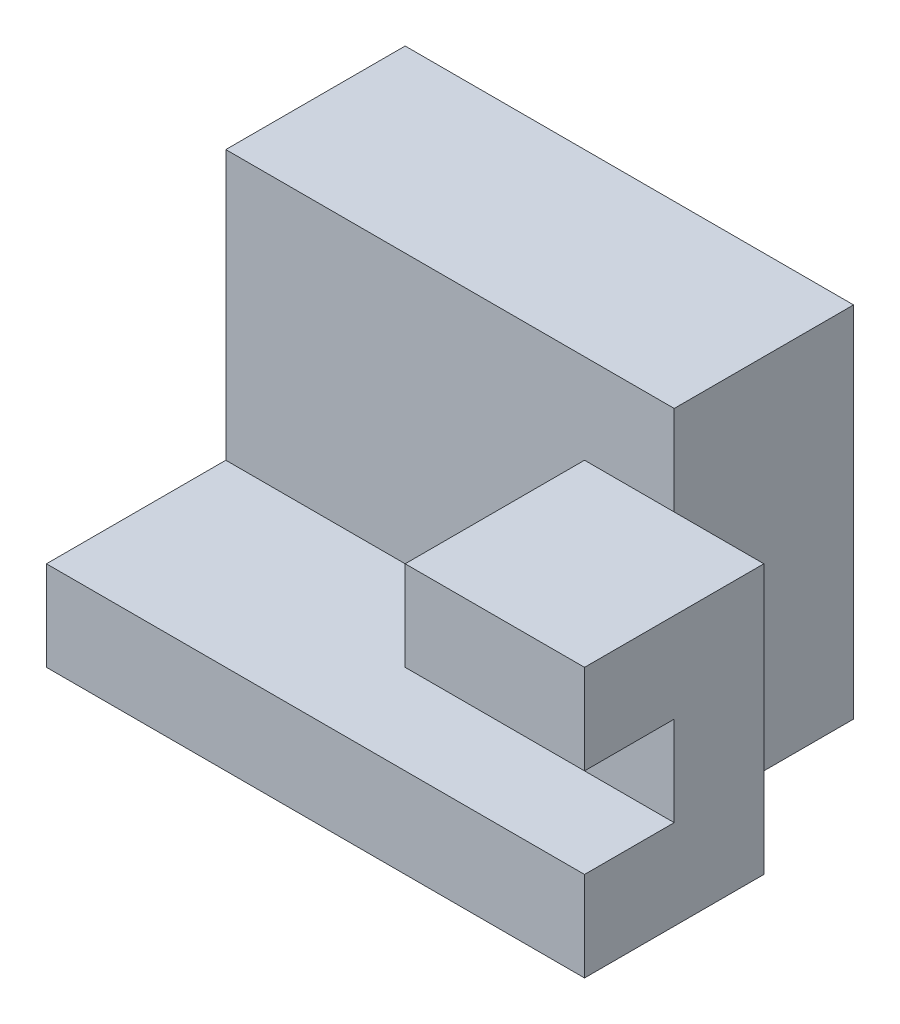
ISO-10303-21;
HEADER;
FILE_DESCRIPTION(('STEP AP214'),'2;1');
FILE_NAME('part.step','',(''),(''),'','','');
FILE_SCHEMA(('AUTOMOTIVE_DESIGN { 1 0 10303 214 1 1 1 1 }'));
ENDSEC;
DATA;
#1=APPLICATION_CONTEXT('core data for automotive mechanical design processes');
#2=APPLICATION_PROTOCOL_DEFINITION('international standard','automotive_design',2000,#1);
#3=PRODUCT_CONTEXT('',#1,'mechanical');
#4=PRODUCT('Part','Part','',(#3));
#5=PRODUCT_RELATED_PRODUCT_CATEGORY('part','',(#4));
#6=PRODUCT_DEFINITION_FORMATION('','',#4);
#7=PRODUCT_DEFINITION_CONTEXT('part definition',#1,'design');
#8=PRODUCT_DEFINITION('design','',#6,#7);
#9=PRODUCT_DEFINITION_SHAPE('','',#8);
#10=(LENGTH_UNIT() NAMED_UNIT(*) SI_UNIT(.MILLI.,.METRE.));
#11=(NAMED_UNIT(*) PLANE_ANGLE_UNIT() SI_UNIT($,.RADIAN.));
#12=(NAMED_UNIT(*) SI_UNIT($,.STERADIAN.) SOLID_ANGLE_UNIT());
#13=UNCERTAINTY_MEASURE_WITH_UNIT(LENGTH_MEASURE(1.E-05),#10,'distance_accuracy_value','');
#14=(GEOMETRIC_REPRESENTATION_CONTEXT(3) GLOBAL_UNCERTAINTY_ASSIGNED_CONTEXT((#13)) GLOBAL_UNIT_ASSIGNED_CONTEXT((#10,
#11,#12)) REPRESENTATION_CONTEXT('',''));
#15=CARTESIAN_POINT('',(0.,0.,0.));
#16=DIRECTION('',(0.,0.,1.));
#17=DIRECTION('',(1.,0.,0.));
#18=AXIS2_PLACEMENT_3D('',#15,#16,#17);
#19=CARTESIAN_POINT('',(0.,0.,0.));
#20=DIRECTION('',(1.,0.,0.));
#21=DIRECTION('',(0.,0.,-1.));
#22=AXIS2_PLACEMENT_3D('',#19,#20,#21);
#23=PLANE('',#22);
#24=DIRECTION('',(0.,1.,0.));
#25=VECTOR('',#24,1.);
#26=CARTESIAN_POINT('',(0.,0.,-20.));
#27=LINE('',#26,#25);
#28=CARTESIAN_POINT('',(0.,0.,-20.));
#29=VERTEX_POINT('',#28);
#30=CARTESIAN_POINT('',(0.,30.,-20.));
#31=VERTEX_POINT('',#30);
#32=EDGE_CURVE('E139',#29,#31,#27,.T.);
#33=ORIENTED_EDGE('',*,*,#32,.F.);
#34=DIRECTION('',(0.,0.,-1.));
#35=VECTOR('',#34,1.);
#36=CARTESIAN_POINT('',(0.,0.,0.));
#37=LINE('',#36,#35);
#38=CARTESIAN_POINT('',(0.,0.,-40.));
#39=VERTEX_POINT('',#38);
#40=EDGE_CURVE('E129',#29,#39,#37,.T.);
#41=ORIENTED_EDGE('',*,*,#40,.T.);
#42=DIRECTION('',(0.,1.,0.));
#43=VECTOR('',#42,1.);
#44=CARTESIAN_POINT('',(0.,0.,-40.));
#45=LINE('',#44,#43);
#46=CARTESIAN_POINT('',(0.,40.,-40.));
#47=VERTEX_POINT('',#46);
#48=EDGE_CURVE('E132',#39,#47,#45,.T.);
#49=ORIENTED_EDGE('',*,*,#48,.T.);
#50=DIRECTION('',(0.,0.,-1.));
#51=VECTOR('',#50,1.);
#52=CARTESIAN_POINT('',(0.,40.,0.));
#53=LINE('',#52,#51);
#54=CARTESIAN_POINT('',(0.,40.,-20.));
#55=VERTEX_POINT('',#54);
#56=EDGE_CURVE('E133',#55,#47,#53,.T.);
#57=ORIENTED_EDGE('',*,*,#56,.F.);
#58=EDGE_CURVE('E83',#31,#55,#27,.T.);
#59=ORIENTED_EDGE('',*,*,#58,.F.);
#60=EDGE_LOOP('',(#33,#41,#49,#57,#59));
#61=FACE_BOUND('',#60,.T.);
#62=ADVANCED_FACE('F41',(#61),#23,.T.);
#63=CARTESIAN_POINT('',(-50.,0.,0.));
#64=DIRECTION('',(0.,-1.,0.));
#65=DIRECTION('',(0.,0.,-1.));
#66=AXIS2_PLACEMENT_3D('',#63,#64,#65);
#67=PLANE('',#66);
#68=DIRECTION('',(0.,0.,-1.));
#69=VECTOR('',#68,1.);
#70=CARTESIAN_POINT('',(10.,0.,0.));
#71=LINE('',#70,#69);
#72=CARTESIAN_POINT('',(10.,0.,0.));
#73=VERTEX_POINT('',#72);
#74=CARTESIAN_POINT('',(10.,0.,-20.));
#75=VERTEX_POINT('',#74);
#76=EDGE_CURVE('E335',#73,#75,#71,.T.);
#77=ORIENTED_EDGE('',*,*,#76,.F.);
#78=DIRECTION('',(1.,0.,0.));
#79=VECTOR('',#78,1.);
#80=CARTESIAN_POINT('',(-50.,0.,0.));
#81=LINE('',#80,#79);
#82=CARTESIAN_POINT('',(-50.,0.,0.));
#83=VERTEX_POINT('',#82);
#84=EDGE_CURVE('E49',#83,#73,#81,.T.);
#85=ORIENTED_EDGE('',*,*,#84,.F.);
#86=DIRECTION('',(0.,0.,-1.));
#87=VECTOR('',#86,1.);
#88=CARTESIAN_POINT('',(-50.,0.,0.));
#89=LINE('',#88,#87);
#90=CARTESIAN_POINT('',(-50.,0.,-40.));
#91=VERTEX_POINT('',#90);
#92=EDGE_CURVE('E136',#83,#91,#89,.T.);
#93=ORIENTED_EDGE('',*,*,#92,.T.);
#94=DIRECTION('',(1.,0.,0.));
#95=VECTOR('',#94,1.);
#96=CARTESIAN_POINT('',(-50.,0.,-40.));
#97=LINE('',#96,#95);
#98=EDGE_CURVE('E87',#91,#39,#97,.T.);
#99=ORIENTED_EDGE('',*,*,#98,.T.);
#100=ORIENTED_EDGE('',*,*,#40,.F.);
#101=DIRECTION('',(-1.,0.,0.));
#102=VECTOR('',#101,1.);
#103=CARTESIAN_POINT('',(10.,0.,-20.));
#104=LINE('',#103,#102);
#105=EDGE_CURVE('E135',#75,#29,#104,.T.);
#106=ORIENTED_EDGE('',*,*,#105,.F.);
#107=EDGE_LOOP('',(#77,#85,#93,#99,#100,#106));
#108=FACE_BOUND('',#107,.T.);
#109=ADVANCED_FACE('F43',(#108),#67,.T.);
#110=CARTESIAN_POINT('',(-50.,0.,0.));
#111=DIRECTION('',(0.,0.,-1.));
#112=DIRECTION('',(-1.,0.,0.));
#113=AXIS2_PLACEMENT_3D('',#110,#111,#112);
#114=PLANE('',#113);
#115=ORIENTED_EDGE('',*,*,#84,.T.);
#116=DIRECTION('',(0.,1.,0.));
#117=VECTOR('',#116,1.);
#118=CARTESIAN_POINT('',(10.,0.,0.));
#119=LINE('',#118,#117);
#120=CARTESIAN_POINT('',(10.,10.,0.));
#121=VERTEX_POINT('',#120);
#122=EDGE_CURVE('E339',#73,#121,#119,.T.);
#123=ORIENTED_EDGE('',*,*,#122,.T.);
#124=DIRECTION('',(1.,0.,0.));
#125=VECTOR('',#124,1.);
#126=CARTESIAN_POINT('',(-50.,10.,0.));
#127=LINE('',#126,#125);
#128=CARTESIAN_POINT('',(-50.,10.,0.));
#129=VERTEX_POINT('',#128);
#130=EDGE_CURVE('E120',#129,#121,#127,.T.);
#131=ORIENTED_EDGE('',*,*,#130,.F.);
#132=DIRECTION('',(0.,1.,0.));
#133=VECTOR('',#132,1.);
#134=CARTESIAN_POINT('',(-50.,0.,0.));
#135=LINE('',#134,#133);
#136=EDGE_CURVE('E104',#83,#129,#135,.T.);
#137=ORIENTED_EDGE('',*,*,#136,.F.);
#138=EDGE_LOOP('',(#115,#123,#131,#137));
#139=FACE_BOUND('',#138,.T.);
#140=ADVANCED_FACE('F185',(#139),#114,.F.);
#141=CARTESIAN_POINT('',(-50.,10.,0.));
#142=DIRECTION('',(0.,-1.,0.));
#143=DIRECTION('',(0.,0.,-1.));
#144=AXIS2_PLACEMENT_3D('',#141,#142,#143);
#145=PLANE('',#144);
#146=ORIENTED_EDGE('',*,*,#130,.T.);
#147=DIRECTION('',(0.,0.,-1.));
#148=VECTOR('',#147,1.);
#149=CARTESIAN_POINT('',(10.,10.,0.));
#150=LINE('',#149,#148);
#151=CARTESIAN_POINT('',(10.,10.,-10.));
#152=VERTEX_POINT('',#151);
#153=EDGE_CURVE('E360',#121,#152,#150,.T.);
#154=ORIENTED_EDGE('',*,*,#153,.T.);
#155=DIRECTION('',(-1.,0.,0.));
#156=VECTOR('',#155,1.);
#157=CARTESIAN_POINT('',(10.,10.,-10.));
#158=LINE('',#157,#156);
#159=CARTESIAN_POINT('',(-10.,10.,-10.));
#160=VERTEX_POINT('',#159);
#161=EDGE_CURVE('E361',#152,#160,#158,.T.);
#162=ORIENTED_EDGE('',*,*,#161,.T.);
#163=DIRECTION('',(0.,0.,1.));
#164=VECTOR('',#163,1.);
#165=CARTESIAN_POINT('',(-10.,10.,0.));
#166=LINE('',#165,#164);
#167=CARTESIAN_POINT('',(-10.,10.,-20.));
#168=VERTEX_POINT('',#167);
#169=EDGE_CURVE('E11',#168,#160,#166,.T.);
#170=ORIENTED_EDGE('',*,*,#169,.F.);
#171=DIRECTION('',(1.,0.,0.));
#172=VECTOR('',#171,1.);
#173=CARTESIAN_POINT('',(-50.,10.,-20.));
#174=LINE('',#173,#172);
#175=CARTESIAN_POINT('',(-50.,10.,-20.));
#176=VERTEX_POINT('',#175);
#177=EDGE_CURVE('E115',#176,#168,#174,.T.);
#178=ORIENTED_EDGE('',*,*,#177,.F.);
#179=DIRECTION('',(0.,0.,-1.));
#180=VECTOR('',#179,1.);
#181=CARTESIAN_POINT('',(-50.,10.,0.));
#182=LINE('',#181,#180);
#183=EDGE_CURVE('E97',#129,#176,#182,.T.);
#184=ORIENTED_EDGE('',*,*,#183,.F.);
#185=EDGE_LOOP('',(#146,#154,#162,#170,#178,#184));
#186=FACE_BOUND('',#185,.T.);
#187=ADVANCED_FACE('F114',(#186),#145,.F.);
#188=CARTESIAN_POINT('',(-50.,0.,-20.));
#189=DIRECTION('',(0.,0.,-1.));
#190=DIRECTION('',(-1.,0.,0.));
#191=AXIS2_PLACEMENT_3D('',#188,#189,#190);
#192=PLANE('',#191);
#193=ORIENTED_EDGE('',*,*,#177,.T.);
#194=DIRECTION('',(0.,1.,0.));
#195=VECTOR('',#194,1.);
#196=CARTESIAN_POINT('',(-10.,0.,-20.));
#197=LINE('',#196,#195);
#198=CARTESIAN_POINT('',(-10.,30.,-20.));
#199=VERTEX_POINT('',#198);
#200=EDGE_CURVE('E365',#168,#199,#197,.T.);
#201=ORIENTED_EDGE('',*,*,#200,.T.);
#202=DIRECTION('',(-1.,0.,0.));
#203=VECTOR('',#202,1.);
#204=CARTESIAN_POINT('',(10.,30.,-20.));
#205=LINE('',#204,#203);
#206=EDGE_CURVE('E162',#31,#199,#205,.T.);
#207=ORIENTED_EDGE('',*,*,#206,.F.);
#208=ORIENTED_EDGE('',*,*,#58,.T.);
#209=DIRECTION('',(1.,0.,0.));
#210=VECTOR('',#209,1.);
#211=CARTESIAN_POINT('',(-50.,40.,-20.));
#212=LINE('',#211,#210);
#213=CARTESIAN_POINT('',(-50.,40.,-20.));
#214=VERTEX_POINT('',#213);
#215=EDGE_CURVE('E119',#214,#55,#212,.T.);
#216=ORIENTED_EDGE('',*,*,#215,.F.);
#217=DIRECTION('',(0.,1.,0.));
#218=VECTOR('',#217,1.);
#219=CARTESIAN_POINT('',(-50.,0.,-20.));
#220=LINE('',#219,#218);
#221=EDGE_CURVE('E102',#176,#214,#220,.T.);
#222=ORIENTED_EDGE('',*,*,#221,.F.);
#223=EDGE_LOOP('',(#193,#201,#207,#208,#216,#222));
#224=FACE_BOUND('',#223,.T.);
#225=ADVANCED_FACE('F118',(#224),#192,.F.);
#226=CARTESIAN_POINT('',(-50.,40.,0.));
#227=DIRECTION('',(0.,-1.,0.));
#228=DIRECTION('',(0.,0.,-1.));
#229=AXIS2_PLACEMENT_3D('',#226,#227,#228);
#230=PLANE('',#229);
#231=ORIENTED_EDGE('',*,*,#56,.T.);
#232=DIRECTION('',(1.,0.,0.));
#233=VECTOR('',#232,1.);
#234=CARTESIAN_POINT('',(-50.,40.,-40.));
#235=LINE('',#234,#233);
#236=CARTESIAN_POINT('',(-50.,40.,-40.));
#237=VERTEX_POINT('',#236);
#238=EDGE_CURVE('E71',#237,#47,#235,.T.);
#239=ORIENTED_EDGE('',*,*,#238,.F.);
#240=DIRECTION('',(0.,0.,-1.));
#241=VECTOR('',#240,1.);
#242=CARTESIAN_POINT('',(-50.,40.,0.));
#243=LINE('',#242,#241);
#244=EDGE_CURVE('E124',#214,#237,#243,.T.);
#245=ORIENTED_EDGE('',*,*,#244,.F.);
#246=ORIENTED_EDGE('',*,*,#215,.T.);
#247=EDGE_LOOP('',(#231,#239,#245,#246));
#248=FACE_BOUND('',#247,.T.);
#249=ADVANCED_FACE('F169',(#248),#230,.F.);
#250=CARTESIAN_POINT('',(-50.,0.,-40.));
#251=DIRECTION('',(0.,0.,-1.));
#252=DIRECTION('',(-1.,0.,0.));
#253=AXIS2_PLACEMENT_3D('',#250,#251,#252);
#254=PLANE('',#253);
#255=ORIENTED_EDGE('',*,*,#48,.F.);
#256=ORIENTED_EDGE('',*,*,#98,.F.);
#257=DIRECTION('',(0.,1.,0.));
#258=VECTOR('',#257,1.);
#259=CARTESIAN_POINT('',(-50.,0.,-40.));
#260=LINE('',#259,#258);
#261=EDGE_CURVE('E125',#91,#237,#260,.T.);
#262=ORIENTED_EDGE('',*,*,#261,.T.);
#263=ORIENTED_EDGE('',*,*,#238,.T.);
#264=EDGE_LOOP('',(#255,#256,#262,#263));
#265=FACE_BOUND('',#264,.T.);
#266=ADVANCED_FACE('F148',(#265),#254,.T.);
#267=CARTESIAN_POINT('',(-50.,0.,0.));
#268=DIRECTION('',(1.,0.,0.));
#269=DIRECTION('',(0.,0.,-1.));
#270=AXIS2_PLACEMENT_3D('',#267,#268,#269);
#271=PLANE('',#270);
#272=ORIENTED_EDGE('',*,*,#92,.F.);
#273=ORIENTED_EDGE('',*,*,#136,.T.);
#274=ORIENTED_EDGE('',*,*,#183,.T.);
#275=ORIENTED_EDGE('',*,*,#221,.T.);
#276=ORIENTED_EDGE('',*,*,#244,.T.);
#277=ORIENTED_EDGE('',*,*,#261,.F.);
#278=EDGE_LOOP('',(#272,#273,#274,#275,#276,#277));
#279=FACE_BOUND('',#278,.T.);
#280=ADVANCED_FACE('F105',(#279),#271,.F.);
#281=CARTESIAN_POINT('',(-10.,0.,0.));
#282=DIRECTION('',(1.,0.,0.));
#283=DIRECTION('',(0.,0.,-1.));
#284=AXIS2_PLACEMENT_3D('',#281,#282,#283);
#285=PLANE('',#284);
#286=ORIENTED_EDGE('',*,*,#200,.F.);
#287=ORIENTED_EDGE('',*,*,#169,.T.);
#288=DIRECTION('',(0.,-1.,0.));
#289=VECTOR('',#288,1.);
#290=CARTESIAN_POINT('',(-10.,0.,-10.));
#291=LINE('',#290,#289);
#292=CARTESIAN_POINT('',(-10.,20.,-10.));
#293=VERTEX_POINT('',#292);
#294=EDGE_CURVE('E343',#293,#160,#291,.T.);
#295=ORIENTED_EDGE('',*,*,#294,.F.);
#296=DIRECTION('',(0.,0.,-1.));
#297=VECTOR('',#296,1.);
#298=CARTESIAN_POINT('',(-10.,20.,0.));
#299=LINE('',#298,#297);
#300=CARTESIAN_POINT('',(-10.,20.,0.));
#301=VERTEX_POINT('',#300);
#302=EDGE_CURVE('E347',#301,#293,#299,.T.);
#303=ORIENTED_EDGE('',*,*,#302,.F.);
#304=DIRECTION('',(0.,-1.,0.));
#305=VECTOR('',#304,1.);
#306=CARTESIAN_POINT('',(-10.,0.,0.));
#307=LINE('',#306,#305);
#308=CARTESIAN_POINT('',(-10.,30.,0.));
#309=VERTEX_POINT('',#308);
#310=EDGE_CURVE('E369',#309,#301,#307,.T.);
#311=ORIENTED_EDGE('',*,*,#310,.F.);
#312=DIRECTION('',(0.,0.,1.));
#313=VECTOR('',#312,1.);
#314=CARTESIAN_POINT('',(-10.,30.,0.));
#315=LINE('',#314,#313);
#316=EDGE_CURVE('E368',#199,#309,#315,.T.);
#317=ORIENTED_EDGE('',*,*,#316,.F.);
#318=EDGE_LOOP('',(#286,#287,#295,#303,#311,#317));
#319=FACE_BOUND('',#318,.T.);
#320=ADVANCED_FACE('F204',(#319),#285,.F.);
#321=CARTESIAN_POINT('',(10.,0.,-20.));
#322=DIRECTION('',(0.,0.,1.));
#323=DIRECTION('',(1.,0.,0.));
#324=AXIS2_PLACEMENT_3D('',#321,#322,#323);
#325=PLANE('',#324);
#326=ORIENTED_EDGE('',*,*,#32,.T.);
#327=CARTESIAN_POINT('',(10.,30.,-20.));
#328=VERTEX_POINT('',#327);
#329=EDGE_CURVE('E161',#328,#31,#205,.T.);
#330=ORIENTED_EDGE('',*,*,#329,.F.);
#331=DIRECTION('',(0.,1.,0.));
#332=VECTOR('',#331,1.);
#333=CARTESIAN_POINT('',(10.,0.,-20.));
#334=LINE('',#333,#332);
#335=EDGE_CURVE('E157',#75,#328,#334,.T.);
#336=ORIENTED_EDGE('',*,*,#335,.F.);
#337=ORIENTED_EDGE('',*,*,#105,.T.);
#338=EDGE_LOOP('',(#326,#330,#336,#337));
#339=FACE_BOUND('',#338,.T.);
#340=ADVANCED_FACE('F156',(#339),#325,.F.);
#341=CARTESIAN_POINT('',(10.,30.,0.));
#342=DIRECTION('',(0.,-1.,0.));
#343=DIRECTION('',(0.,0.,-1.));
#344=AXIS2_PLACEMENT_3D('',#341,#342,#343);
#345=PLANE('',#344);
#346=ORIENTED_EDGE('',*,*,#316,.T.);
#347=DIRECTION('',(-1.,0.,0.));
#348=VECTOR('',#347,1.);
#349=CARTESIAN_POINT('',(10.,30.,0.));
#350=LINE('',#349,#348);
#351=CARTESIAN_POINT('',(10.,30.,0.));
#352=VERTEX_POINT('',#351);
#353=EDGE_CURVE('E379',#352,#309,#350,.T.);
#354=ORIENTED_EDGE('',*,*,#353,.F.);
#355=DIRECTION('',(0.,0.,1.));
#356=VECTOR('',#355,1.);
#357=CARTESIAN_POINT('',(10.,30.,0.));
#358=LINE('',#357,#356);
#359=EDGE_CURVE('E342',#328,#352,#358,.T.);
#360=ORIENTED_EDGE('',*,*,#359,.F.);
#361=ORIENTED_EDGE('',*,*,#329,.T.);
#362=ORIENTED_EDGE('',*,*,#206,.T.);
#363=EDGE_LOOP('',(#346,#354,#360,#361,#362));
#364=FACE_BOUND('',#363,.T.);
#365=ADVANCED_FACE('F216',(#364),#345,.F.);
#366=CARTESIAN_POINT('',(10.,0.,0.));
#367=DIRECTION('',(0.,0.,-1.));
#368=DIRECTION('',(0.,1.,0.));
#369=AXIS2_PLACEMENT_3D('',#366,#367,#368);
#370=PLANE('',#369);
#371=ORIENTED_EDGE('',*,*,#310,.T.);
#372=DIRECTION('',(-1.,0.,0.));
#373=VECTOR('',#372,1.);
#374=CARTESIAN_POINT('',(10.,20.,0.));
#375=LINE('',#374,#373);
#376=CARTESIAN_POINT('',(10.,20.,0.));
#377=VERTEX_POINT('',#376);
#378=EDGE_CURVE('E378',#377,#301,#375,.T.);
#379=ORIENTED_EDGE('',*,*,#378,.F.);
#380=DIRECTION('',(0.,-1.,0.));
#381=VECTOR('',#380,1.);
#382=CARTESIAN_POINT('',(10.,0.,0.));
#383=LINE('',#382,#381);
#384=EDGE_CURVE('E348',#352,#377,#383,.T.);
#385=ORIENTED_EDGE('',*,*,#384,.F.);
#386=ORIENTED_EDGE('',*,*,#353,.T.);
#387=EDGE_LOOP('',(#371,#379,#385,#386));
#388=FACE_BOUND('',#387,.T.);
#389=ADVANCED_FACE('F225',(#388),#370,.F.);
#390=CARTESIAN_POINT('',(10.,20.,0.));
#391=DIRECTION('',(0.,1.,0.));
#392=DIRECTION('',(0.,0.,1.));
#393=AXIS2_PLACEMENT_3D('',#390,#391,#392);
#394=PLANE('',#393);
#395=ORIENTED_EDGE('',*,*,#302,.T.);
#396=DIRECTION('',(-1.,0.,0.));
#397=VECTOR('',#396,1.);
#398=CARTESIAN_POINT('',(10.,20.,-10.));
#399=LINE('',#398,#397);
#400=CARTESIAN_POINT('',(10.,20.,-10.));
#401=VERTEX_POINT('',#400);
#402=EDGE_CURVE('E374',#401,#293,#399,.T.);
#403=ORIENTED_EDGE('',*,*,#402,.F.);
#404=DIRECTION('',(0.,0.,-1.));
#405=VECTOR('',#404,1.);
#406=CARTESIAN_POINT('',(10.,20.,0.));
#407=LINE('',#406,#405);
#408=EDGE_CURVE('E354',#377,#401,#407,.T.);
#409=ORIENTED_EDGE('',*,*,#408,.F.);
#410=ORIENTED_EDGE('',*,*,#378,.T.);
#411=EDGE_LOOP('',(#395,#403,#409,#410));
#412=FACE_BOUND('',#411,.T.);
#413=ADVANCED_FACE('F233',(#412),#394,.F.);
#414=CARTESIAN_POINT('',(10.,0.,-10.));
#415=DIRECTION('',(0.,0.,-1.));
#416=DIRECTION('',(0.,1.,0.));
#417=AXIS2_PLACEMENT_3D('',#414,#415,#416);
#418=PLANE('',#417);
#419=ORIENTED_EDGE('',*,*,#294,.T.);
#420=ORIENTED_EDGE('',*,*,#161,.F.);
#421=DIRECTION('',(0.,-1.,0.));
#422=VECTOR('',#421,1.);
#423=CARTESIAN_POINT('',(10.,0.,-10.));
#424=LINE('',#423,#422);
#425=EDGE_CURVE('E358',#401,#152,#424,.T.);
#426=ORIENTED_EDGE('',*,*,#425,.F.);
#427=ORIENTED_EDGE('',*,*,#402,.T.);
#428=EDGE_LOOP('',(#419,#420,#426,#427));
#429=FACE_BOUND('',#428,.T.);
#430=ADVANCED_FACE('F238',(#429),#418,.F.);
#431=CARTESIAN_POINT('',(10.,0.,0.));
#432=DIRECTION('',(1.,0.,0.));
#433=DIRECTION('',(0.,0.,-1.));
#434=AXIS2_PLACEMENT_3D('',#431,#432,#433);
#435=PLANE('',#434);
#436=ORIENTED_EDGE('',*,*,#76,.T.);
#437=ORIENTED_EDGE('',*,*,#335,.T.);
#438=ORIENTED_EDGE('',*,*,#359,.T.);
#439=ORIENTED_EDGE('',*,*,#384,.T.);
#440=ORIENTED_EDGE('',*,*,#408,.T.);
#441=ORIENTED_EDGE('',*,*,#425,.T.);
#442=ORIENTED_EDGE('',*,*,#153,.F.);
#443=ORIENTED_EDGE('',*,*,#122,.F.);
#444=EDGE_LOOP('',(#436,#437,#438,#439,#440,#441,#442,#443));
#445=FACE_BOUND('',#444,.T.);
#446=ADVANCED_FACE('F250',(#445),#435,.T.);
#447=CLOSED_SHELL('',(#62,#109,#140,#187,#225,#249,#266,#280,#320,#340,#365,#389,#413,#430,#446));
#448=MANIFOLD_SOLID_BREP('B2',#447);
#449=ADVANCED_BREP_SHAPE_REPRESENTATION('',(#18,#448),#14);
#450=SHAPE_DEFINITION_REPRESENTATION(#9,#449);
ENDSEC;
END-ISO-10303-21;
